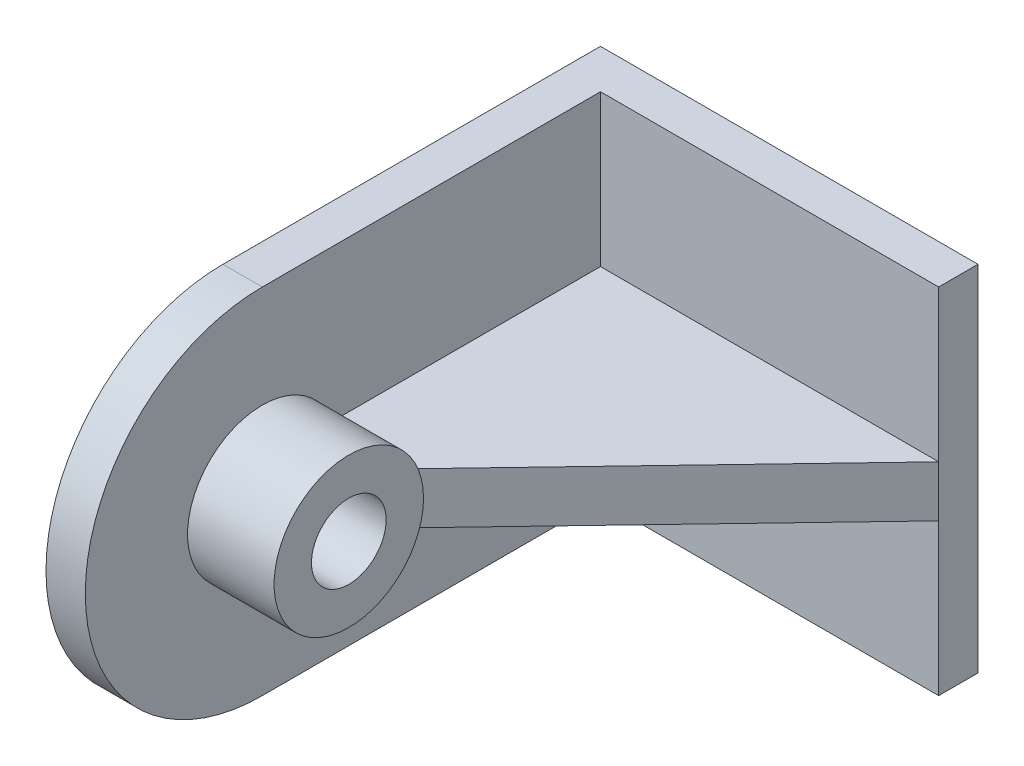
ISO-10303-21;
HEADER;
FILE_DESCRIPTION(('STEP AP214'),'2;1');
FILE_NAME('part.step','',(''),(''),'','','');
FILE_SCHEMA(('AUTOMOTIVE_DESIGN { 1 0 10303 214 1 1 1 1 }'));
ENDSEC;
DATA;
#1=APPLICATION_CONTEXT('core data for automotive mechanical design processes');
#2=APPLICATION_PROTOCOL_DEFINITION('international standard','automotive_design',2000,#1);
#3=PRODUCT_CONTEXT('',#1,'mechanical');
#4=PRODUCT('Part','Part','',(#3));
#5=PRODUCT_RELATED_PRODUCT_CATEGORY('part','',(#4));
#6=PRODUCT_DEFINITION_FORMATION('','',#4);
#7=PRODUCT_DEFINITION_CONTEXT('part definition',#1,'design');
#8=PRODUCT_DEFINITION('design','',#6,#7);
#9=PRODUCT_DEFINITION_SHAPE('','',#8);
#10=(LENGTH_UNIT() NAMED_UNIT(*) SI_UNIT(.MILLI.,.METRE.));
#11=(NAMED_UNIT(*) PLANE_ANGLE_UNIT() SI_UNIT($,.RADIAN.));
#12=(NAMED_UNIT(*) SI_UNIT($,.STERADIAN.) SOLID_ANGLE_UNIT());
#13=UNCERTAINTY_MEASURE_WITH_UNIT(LENGTH_MEASURE(1.E-05),#10,'distance_accuracy_value','');
#14=(GEOMETRIC_REPRESENTATION_CONTEXT(3) GLOBAL_UNCERTAINTY_ASSIGNED_CONTEXT((#13)) GLOBAL_UNIT_ASSIGNED_CONTEXT((#10,
#11,#12)) REPRESENTATION_CONTEXT('',''));
#15=CARTESIAN_POINT('',(0.,0.,0.));
#16=DIRECTION('',(0.,0.,1.));
#17=DIRECTION('',(1.,0.,0.));
#18=AXIS2_PLACEMENT_3D('',#15,#16,#17);
#19=CARTESIAN_POINT('',(0.,0.,10.));
#20=DIRECTION('',(0.,0.,1.));
#21=DIRECTION('',(1.,0.,0.));
#22=AXIS2_PLACEMENT_3D('',#19,#20,#21);
#23=PLANE('',#22);
#24=DIRECTION('',(0.,1.,0.));
#25=VECTOR('',#24,1.);
#26=CARTESIAN_POINT('',(48.,-45.,10.));
#27=LINE('',#26,#25);
#28=CARTESIAN_POINT('',(48.,-45.,10.));
#29=VERTEX_POINT('',#28);
#30=CARTESIAN_POINT('',(48.,-6.50000000000001,10.));
#31=VERTEX_POINT('',#30);
#32=EDGE_CURVE('E193',#29,#31,#27,.T.);
#33=ORIENTED_EDGE('',*,*,#32,.T.);
#34=DIRECTION('',(-1.,0.,0.));
#35=VECTOR('',#34,1.);
#36=CARTESIAN_POINT('',(0.,-6.5,10.));
#37=LINE('',#36,#35);
#38=CARTESIAN_POINT('',(-38.,-6.5,10.));
#39=VERTEX_POINT('',#38);
#40=EDGE_CURVE('E141',#31,#39,#37,.T.);
#41=ORIENTED_EDGE('',*,*,#40,.T.);
#42=DIRECTION('',(0.,1.,0.));
#43=VECTOR('',#42,1.);
#44=CARTESIAN_POINT('',(-38.,0.,10.));
#45=LINE('',#44,#43);
#46=CARTESIAN_POINT('',(-38.,-45.,10.));
#47=VERTEX_POINT('',#46);
#48=EDGE_CURVE('E138',#47,#39,#45,.T.);
#49=ORIENTED_EDGE('',*,*,#48,.F.);
#50=DIRECTION('',(1.,0.,0.));
#51=VECTOR('',#50,1.);
#52=CARTESIAN_POINT('',(-48.,-45.,10.));
#53=LINE('',#52,#51);
#54=EDGE_CURVE('E189',#47,#29,#53,.T.);
#55=ORIENTED_EDGE('',*,*,#54,.T.);
#56=EDGE_LOOP('',(#33,#41,#49,#55));
#57=FACE_BOUND('',#56,.T.);
#58=ADVANCED_FACE('F39',(#57),#23,.T.);
#59=CARTESIAN_POINT('',(-48.,45.,10.));
#60=DIRECTION('',(0.,-1.,0.));
#61=DIRECTION('',(1.,0.,0.));
#62=AXIS2_PLACEMENT_3D('',#59,#60,#61);
#63=PLANE('',#62);
#64=DIRECTION('',(-1.,0.,0.));
#65=VECTOR('',#64,1.);
#66=CARTESIAN_POINT('',(-48.,45.,0.));
#67=LINE('',#66,#65);
#68=CARTESIAN_POINT('',(48.,45.,0.));
#69=VERTEX_POINT('',#68);
#70=CARTESIAN_POINT('',(-48.,45.,0.));
#71=VERTEX_POINT('',#70);
#72=EDGE_CURVE('E185',#69,#71,#67,.T.);
#73=ORIENTED_EDGE('',*,*,#72,.T.);
#74=DIRECTION('',(0.,0.,-1.));
#75=VECTOR('',#74,1.);
#76=CARTESIAN_POINT('',(-48.,45.,10.));
#77=LINE('',#76,#75);
#78=CARTESIAN_POINT('',(-48.,45.,96.));
#79=VERTEX_POINT('',#78);
#80=EDGE_CURVE('E47',#79,#71,#77,.T.);
#81=ORIENTED_EDGE('',*,*,#80,.F.);
#82=DIRECTION('',(-1.,0.,0.));
#83=VECTOR('',#82,1.);
#84=CARTESIAN_POINT('',(-38.,45.,96.));
#85=LINE('',#84,#83);
#86=CARTESIAN_POINT('',(-38.,45.,96.));
#87=VERTEX_POINT('',#86);
#88=EDGE_CURVE('E178',#87,#79,#85,.T.);
#89=ORIENTED_EDGE('',*,*,#88,.F.);
#90=DIRECTION('',(0.,0.,-1.));
#91=VECTOR('',#90,1.);
#92=CARTESIAN_POINT('',(-38.,45.,0.));
#93=LINE('',#92,#91);
#94=CARTESIAN_POINT('',(-38.,45.,10.));
#95=VERTEX_POINT('',#94);
#96=EDGE_CURVE('E172',#87,#95,#93,.T.);
#97=ORIENTED_EDGE('',*,*,#96,.T.);
#98=DIRECTION('',(-1.,0.,0.));
#99=VECTOR('',#98,1.);
#100=CARTESIAN_POINT('',(-48.,45.,10.));
#101=LINE('',#100,#99);
#102=CARTESIAN_POINT('',(48.,45.,10.));
#103=VERTEX_POINT('',#102);
#104=EDGE_CURVE('E186',#103,#95,#101,.T.);
#105=ORIENTED_EDGE('',*,*,#104,.F.);
#106=DIRECTION('',(0.,0.,-1.));
#107=VECTOR('',#106,1.);
#108=CARTESIAN_POINT('',(48.,45.,10.));
#109=LINE('',#108,#107);
#110=EDGE_CURVE('E195',#103,#69,#109,.T.);
#111=ORIENTED_EDGE('',*,*,#110,.T.);
#112=EDGE_LOOP('',(#73,#81,#89,#97,#105,#111));
#113=FACE_BOUND('',#112,.T.);
#114=ADVANCED_FACE('F41',(#113),#63,.F.);
#115=CARTESIAN_POINT('',(-48.,-45.,10.));
#116=DIRECTION('',(1.,0.,0.));
#117=DIRECTION('',(0.,0.,-1.));
#118=AXIS2_PLACEMENT_3D('',#115,#116,#117);
#119=PLANE('',#118);
#120=DIRECTION('',(0.,-1.,0.));
#121=VECTOR('',#120,1.);
#122=CARTESIAN_POINT('',(-48.,-45.,0.));
#123=LINE('',#122,#121);
#124=CARTESIAN_POINT('',(-48.,-45.,0.));
#125=VERTEX_POINT('',#124);
#126=EDGE_CURVE('E197',#71,#125,#123,.T.);
#127=ORIENTED_EDGE('',*,*,#126,.T.);
#128=DIRECTION('',(0.,0.,-1.));
#129=VECTOR('',#128,1.);
#130=CARTESIAN_POINT('',(-48.,-45.,10.));
#131=LINE('',#130,#129);
#132=CARTESIAN_POINT('',(-48.,-45.,96.));
#133=VERTEX_POINT('',#132);
#134=EDGE_CURVE('E207',#133,#125,#131,.T.);
#135=ORIENTED_EDGE('',*,*,#134,.F.);
#136=CARTESIAN_POINT('',(-48.,0.,96.));
#137=DIRECTION('',(-1.,0.,0.));
#138=DIRECTION('',(0.,0.,-1.));
#139=AXIS2_PLACEMENT_3D('',#136,#137,#138);
#140=CIRCLE('',#139,45.);
#141=EDGE_CURVE('E165',#133,#79,#140,.T.);
#142=ORIENTED_EDGE('',*,*,#141,.T.);
#143=ORIENTED_EDGE('',*,*,#80,.T.);
#144=EDGE_LOOP('',(#127,#135,#142,#143));
#145=FACE_BOUND('',#144,.T.);
#146=ADVANCED_FACE('F211',(#145),#119,.F.);
#147=CARTESIAN_POINT('',(-48.,-45.,10.));
#148=DIRECTION('',(0.,1.,0.));
#149=DIRECTION('',(-1.,0.,0.));
#150=AXIS2_PLACEMENT_3D('',#147,#148,#149);
#151=PLANE('',#150);
#152=ORIENTED_EDGE('',*,*,#54,.F.);
#153=DIRECTION('',(0.,0.,1.));
#154=VECTOR('',#153,1.);
#155=CARTESIAN_POINT('',(-38.,-45.,96.));
#156=LINE('',#155,#154);
#157=CARTESIAN_POINT('',(-38.,-45.,96.));
#158=VERTEX_POINT('',#157);
#159=EDGE_CURVE('E167',#47,#158,#156,.T.);
#160=ORIENTED_EDGE('',*,*,#159,.T.);
#161=DIRECTION('',(-1.,0.,0.));
#162=VECTOR('',#161,1.);
#163=CARTESIAN_POINT('',(-38.,-45.,96.));
#164=LINE('',#163,#162);
#165=EDGE_CURVE('E175',#158,#133,#164,.T.);
#166=ORIENTED_EDGE('',*,*,#165,.T.);
#167=ORIENTED_EDGE('',*,*,#134,.T.);
#168=DIRECTION('',(1.,0.,0.));
#169=VECTOR('',#168,1.);
#170=CARTESIAN_POINT('',(-48.,-45.,0.));
#171=LINE('',#170,#169);
#172=CARTESIAN_POINT('',(48.,-45.,0.));
#173=VERTEX_POINT('',#172);
#174=EDGE_CURVE('E199',#125,#173,#171,.T.);
#175=ORIENTED_EDGE('',*,*,#174,.T.);
#176=DIRECTION('',(0.,0.,-1.));
#177=VECTOR('',#176,1.);
#178=CARTESIAN_POINT('',(48.,-45.,10.));
#179=LINE('',#178,#177);
#180=EDGE_CURVE('E204',#29,#173,#179,.T.);
#181=ORIENTED_EDGE('',*,*,#180,.F.);
#182=EDGE_LOOP('',(#152,#160,#166,#167,#175,#181));
#183=FACE_BOUND('',#182,.T.);
#184=ADVANCED_FACE('F232',(#183),#151,.F.);
#185=CARTESIAN_POINT('',(48.,-45.,10.));
#186=DIRECTION('',(-1.,0.,0.));
#187=DIRECTION('',(0.,0.,1.));
#188=AXIS2_PLACEMENT_3D('',#185,#186,#187);
#189=PLANE('',#188);
#190=CARTESIAN_POINT('',(48.,6.49999999999998,10.));
#191=VERTEX_POINT('',#190);
#192=EDGE_CURVE('E192',#191,#103,#27,.T.);
#193=ORIENTED_EDGE('',*,*,#192,.F.);
#194=DIRECTION('',(0.,-1.,0.));
#195=VECTOR('',#194,1.);
#196=CARTESIAN_POINT('',(48.,0.,10.));
#197=LINE('',#196,#195);
#198=EDGE_CURVE('E61',#31,#191,#197,.F.);
#199=ORIENTED_EDGE('',*,*,#198,.F.);
#200=ORIENTED_EDGE('',*,*,#32,.F.);
#201=ORIENTED_EDGE('',*,*,#180,.T.);
#202=DIRECTION('',(0.,1.,0.));
#203=VECTOR('',#202,1.);
#204=CARTESIAN_POINT('',(48.,-45.,0.));
#205=LINE('',#204,#203);
#206=EDGE_CURVE('E190',#173,#69,#205,.T.);
#207=ORIENTED_EDGE('',*,*,#206,.T.);
#208=ORIENTED_EDGE('',*,*,#110,.F.);
#209=EDGE_LOOP('',(#193,#199,#200,#201,#207,#208));
#210=FACE_BOUND('',#209,.T.);
#211=ADVANCED_FACE('F224',(#210),#189,.F.);
#212=DIRECTION('',(-1.,0.,0.));
#213=VECTOR('',#212,1.);
#214=CARTESIAN_POINT('',(0.,6.5,10.));
#215=LINE('',#214,#213);
#216=CARTESIAN_POINT('',(-38.,6.5,10.));
#217=VERTEX_POINT('',#216);
#218=EDGE_CURVE('E54',#191,#217,#215,.T.);
#219=ORIENTED_EDGE('',*,*,#218,.F.);
#220=ORIENTED_EDGE('',*,*,#192,.T.);
#221=ORIENTED_EDGE('',*,*,#104,.T.);
#222=EDGE_CURVE('E181',#217,#95,#45,.T.);
#223=ORIENTED_EDGE('',*,*,#222,.F.);
#224=EDGE_LOOP('',(#219,#220,#221,#223));
#225=FACE_BOUND('',#224,.T.);
#226=ADVANCED_FACE('F223',(#225),#23,.T.);
#227=CARTESIAN_POINT('',(0.,0.,0.));
#228=DIRECTION('',(0.,0.,1.));
#229=DIRECTION('',(1.,0.,0.));
#230=AXIS2_PLACEMENT_3D('',#227,#228,#229);
#231=PLANE('',#230);
#232=ORIENTED_EDGE('',*,*,#72,.F.);
#233=ORIENTED_EDGE('',*,*,#206,.F.);
#234=ORIENTED_EDGE('',*,*,#174,.F.);
#235=ORIENTED_EDGE('',*,*,#126,.F.);
#236=EDGE_LOOP('',(#232,#233,#234,#235));
#237=FACE_BOUND('',#236,.T.);
#238=ADVANCED_FACE('F229',(#237),#231,.F.);
#239=CARTESIAN_POINT('',(-38.,0.,96.));
#240=DIRECTION('',(-1.,0.,0.));
#241=DIRECTION('',(0.,0.,1.));
#242=AXIS2_PLACEMENT_3D('',#239,#240,#241);
#243=CYLINDRICAL_SURFACE('',#242,45.);
#244=ORIENTED_EDGE('',*,*,#141,.F.);
#245=ORIENTED_EDGE('',*,*,#165,.F.);
#246=CARTESIAN_POINT('',(-38.,0.,96.));
#247=DIRECTION('',(-1.,0.,0.));
#248=DIRECTION('',(0.,0.,-1.));
#249=AXIS2_PLACEMENT_3D('',#246,#247,#248);
#250=CIRCLE('',#249,45.);
#251=EDGE_CURVE('E169',#158,#87,#250,.T.);
#252=ORIENTED_EDGE('',*,*,#251,.T.);
#253=ORIENTED_EDGE('',*,*,#88,.T.);
#254=EDGE_LOOP('',(#244,#245,#252,#253));
#255=FACE_BOUND('',#254,.T.);
#256=ADVANCED_FACE('F217',(#255),#243,.T.);
#257=CARTESIAN_POINT('',(-38.,0.,96.));
#258=DIRECTION('',(1.,0.,0.));
#259=DIRECTION('',(0.,0.,-1.));
#260=AXIS2_PLACEMENT_3D('',#257,#258,#259);
#261=PLANE('',#260);
#262=DIRECTION('',(0.,0.,1.));
#263=VECTOR('',#262,1.);
#264=CARTESIAN_POINT('',(-38.,6.5,96.));
#265=LINE('',#264,#263);
#266=CARTESIAN_POINT('',(-38.,6.5,78.1464289286429));
#267=VERTEX_POINT('',#266);
#268=EDGE_CURVE('E155',#217,#267,#265,.T.);
#269=ORIENTED_EDGE('',*,*,#268,.F.);
#270=ORIENTED_EDGE('',*,*,#222,.T.);
#271=ORIENTED_EDGE('',*,*,#96,.F.);
#272=ORIENTED_EDGE('',*,*,#251,.F.);
#273=ORIENTED_EDGE('',*,*,#159,.F.);
#274=ORIENTED_EDGE('',*,*,#48,.T.);
#275=DIRECTION('',(0.,0.,1.));
#276=VECTOR('',#275,1.);
#277=CARTESIAN_POINT('',(-38.,-6.5,96.));
#278=LINE('',#277,#276);
#279=CARTESIAN_POINT('',(-38.,-6.5,78.1464289286429));
#280=VERTEX_POINT('',#279);
#281=EDGE_CURVE('E135',#39,#280,#278,.T.);
#282=ORIENTED_EDGE('',*,*,#281,.T.);
#283=CARTESIAN_POINT('',(-38.,0.,96.));
#284=DIRECTION('',(1.,0.,0.));
#285=DIRECTION('',(0.,0.,-1.));
#286=AXIS2_PLACEMENT_3D('',#283,#284,#285);
#287=CIRCLE('',#286,19.);
#288=EDGE_CURVE('E120',#267,#280,#287,.T.);
#289=ORIENTED_EDGE('',*,*,#288,.F.);
#290=EDGE_LOOP('',(#269,#270,#271,#272,#273,#274,#282,#289));
#291=FACE_BOUND('',#290,.T.);
#292=ADVANCED_FACE('F136',(#291),#261,.T.);
#293=CARTESIAN_POINT('',(-16.,0.,96.));
#294=DIRECTION('',(1.,0.,0.));
#295=DIRECTION('',(0.,0.,-1.));
#296=AXIS2_PLACEMENT_3D('',#293,#294,#295);
#297=PLANE('',#296);
#298=CARTESIAN_POINT('',(-16.,0.,96.));
#299=DIRECTION('',(1.,0.,0.));
#300=DIRECTION('',(0.,0.,-1.));
#301=AXIS2_PLACEMENT_3D('',#298,#299,#300);
#302=CIRCLE('',#301,19.);
#303=CARTESIAN_POINT('',(-16.,0.,77.));
#304=VERTEX_POINT('',#303);
#305=EDGE_CURVE('E130',#304,#304,#302,.T.);
#306=ORIENTED_EDGE('',*,*,#305,.T.);
#307=EDGE_LOOP('',(#306));
#308=FACE_BOUND('',#307,.T.);
#309=CARTESIAN_POINT('',(-16.,0.,96.));
#310=DIRECTION('',(1.,0.,0.));
#311=DIRECTION('',(0.,0.,-1.));
#312=AXIS2_PLACEMENT_3D('',#309,#310,#311);
#313=CIRCLE('',#312,9.5);
#314=CARTESIAN_POINT('',(-16.,0.,86.5));
#315=VERTEX_POINT('',#314);
#316=EDGE_CURVE('E131',#315,#315,#313,.T.);
#317=ORIENTED_EDGE('',*,*,#316,.F.);
#318=EDGE_LOOP('',(#317));
#319=FACE_BOUND('',#318,.T.);
#320=ADVANCED_FACE('F240',(#308,#319),#297,.T.);
#321=CARTESIAN_POINT('',(-16.,0.,96.));
#322=DIRECTION('',(-1.,0.,0.));
#323=DIRECTION('',(0.,0.,1.));
#324=AXIS2_PLACEMENT_3D('',#321,#322,#323);
#325=CYLINDRICAL_SURFACE('',#324,19.);
#326=CARTESIAN_POINT('',(-34.1492537313433,0.,96.));
#327=DIRECTION('',(-0.723110475283121,0.,-0.690732394300295));
#328=DIRECTION('',(-0.690732394300295,0.,0.723110475283121));
#329=AXIS2_PLACEMENT_3D('',#326,#327,#328);
#330=ELLIPSE('',#329,26.2753765149936,19.);
#331=CARTESIAN_POINT('',(-17.0950962900469,6.5,78.1464289286429));
#332=VERTEX_POINT('',#331);
#333=EDGE_CURVE('E158',#304,#332,#330,.F.);
#334=ORIENTED_EDGE('',*,*,#333,.T.);
#335=DIRECTION('',(-1.,0.,0.));
#336=VECTOR('',#335,1.);
#337=CARTESIAN_POINT('',(-16.,6.5,78.1464289286429));
#338=LINE('',#337,#336);
#339=EDGE_CURVE('E127',#332,#267,#338,.T.);
#340=ORIENTED_EDGE('',*,*,#339,.T.);
#341=ORIENTED_EDGE('',*,*,#288,.T.);
#342=DIRECTION('',(-1.,0.,0.));
#343=VECTOR('',#342,1.);
#344=CARTESIAN_POINT('',(-16.,-6.5,78.1464289286429));
#345=LINE('',#344,#343);
#346=CARTESIAN_POINT('',(-17.0950962900469,-6.5,78.1464289286429));
#347=VERTEX_POINT('',#346);
#348=EDGE_CURVE('E124',#347,#280,#345,.T.);
#349=ORIENTED_EDGE('',*,*,#348,.F.);
#350=EDGE_CURVE('E160',#347,#304,#330,.F.);
#351=ORIENTED_EDGE('',*,*,#350,.T.);
#352=ORIENTED_EDGE('',*,*,#305,.F.);
#353=EDGE_LOOP('',(#334,#340,#341,#349,#351,#352));
#354=FACE_BOUND('',#353,.T.);
#355=ADVANCED_FACE('F122',(#354),#325,.T.);
#356=CARTESIAN_POINT('',(-16.,0.,96.));
#357=DIRECTION('',(-1.,0.,0.));
#358=DIRECTION('',(0.,0.,1.));
#359=AXIS2_PLACEMENT_3D('',#356,#357,#358);
#360=CYLINDRICAL_SURFACE('',#359,9.5);
#361=CARTESIAN_POINT('',(-38.,0.,96.));
#362=DIRECTION('',(1.,0.,0.));
#363=DIRECTION('',(0.,0.,-1.));
#364=AXIS2_PLACEMENT_3D('',#361,#362,#363);
#365=CIRCLE('',#364,9.5);
#366=CARTESIAN_POINT('',(-38.,0.,86.5));
#367=VERTEX_POINT('',#366);
#368=EDGE_CURVE('E11',#367,#367,#365,.F.);
#369=ORIENTED_EDGE('',*,*,#368,.T.);
#370=EDGE_LOOP('',(#369));
#371=FACE_BOUND('',#370,.T.);
#372=ORIENTED_EDGE('',*,*,#316,.T.);
#373=EDGE_LOOP('',(#372));
#374=FACE_BOUND('',#373,.T.);
#375=ADVANCED_FACE('F246',(#371,#374),#360,.F.);
#376=ORIENTED_EDGE('',*,*,#368,.F.);
#377=EDGE_LOOP('',(#376));
#378=FACE_BOUND('',#377,.T.);
#379=ADVANCED_FACE('F248',(#378),#261,.T.);
#380=CARTESIAN_POINT('',(48.,0.,10.));
#381=DIRECTION('',(-0.723110475283121,0.,-0.690732394300295));
#382=DIRECTION('',(-0.690732394300295,0.,0.723110475283121));
#383=AXIS2_PLACEMENT_3D('',#380,#381,#382);
#384=PLANE('',#383);
#385=DIRECTION('',(-0.690732394300295,0.,0.723110475283121));
#386=VECTOR('',#385,1.);
#387=CARTESIAN_POINT('',(48.,-6.5,10.));
#388=LINE('',#387,#386);
#389=EDGE_CURVE('E146',#31,#347,#388,.T.);
#390=ORIENTED_EDGE('',*,*,#389,.F.);
#391=ORIENTED_EDGE('',*,*,#198,.T.);
#392=DIRECTION('',(-0.690732394300295,0.,0.723110475283121));
#393=VECTOR('',#392,1.);
#394=CARTESIAN_POINT('',(48.,6.5,10.));
#395=LINE('',#394,#393);
#396=EDGE_CURVE('E147',#191,#332,#395,.T.);
#397=ORIENTED_EDGE('',*,*,#396,.T.);
#398=ORIENTED_EDGE('',*,*,#333,.F.);
#399=ORIENTED_EDGE('',*,*,#350,.F.);
#400=EDGE_LOOP('',(#390,#391,#397,#398,#399));
#401=FACE_BOUND('',#400,.T.);
#402=ADVANCED_FACE('F235',(#401),#384,.F.);
#403=CARTESIAN_POINT('',(0.,6.5,70.5));
#404=DIRECTION('',(0.,1.,0.));
#405=DIRECTION('',(0.,0.,1.));
#406=AXIS2_PLACEMENT_3D('',#403,#404,#405);
#407=PLANE('',#406);
#408=ORIENTED_EDGE('',*,*,#396,.F.);
#409=ORIENTED_EDGE('',*,*,#218,.T.);
#410=ORIENTED_EDGE('',*,*,#268,.T.);
#411=ORIENTED_EDGE('',*,*,#339,.F.);
#412=EDGE_LOOP('',(#408,#409,#410,#411));
#413=FACE_BOUND('',#412,.T.);
#414=ADVANCED_FACE('F344',(#413),#407,.T.);
#415=CARTESIAN_POINT('',(0.,-6.5,70.5));
#416=DIRECTION('',(0.,1.,0.));
#417=DIRECTION('',(0.,0.,1.));
#418=AXIS2_PLACEMENT_3D('',#415,#416,#417);
#419=PLANE('',#418);
#420=ORIENTED_EDGE('',*,*,#40,.F.);
#421=ORIENTED_EDGE('',*,*,#389,.T.);
#422=ORIENTED_EDGE('',*,*,#348,.T.);
#423=ORIENTED_EDGE('',*,*,#281,.F.);
#424=EDGE_LOOP('',(#420,#421,#422,#423));
#425=FACE_BOUND('',#424,.T.);
#426=ADVANCED_FACE('F144',(#425),#419,.F.);
#427=CLOSED_SHELL('',(#58,#114,#146,#184,#211,#226,#238,#256,#292,#320,#355,#375,#379,#402,#414,#426));
#428=MANIFOLD_SOLID_BREP('B2',#427);
#429=ADVANCED_BREP_SHAPE_REPRESENTATION('',(#18,#428),#14);
#430=SHAPE_DEFINITION_REPRESENTATION(#9,#429);
ENDSEC;
END-ISO-10303-21;
